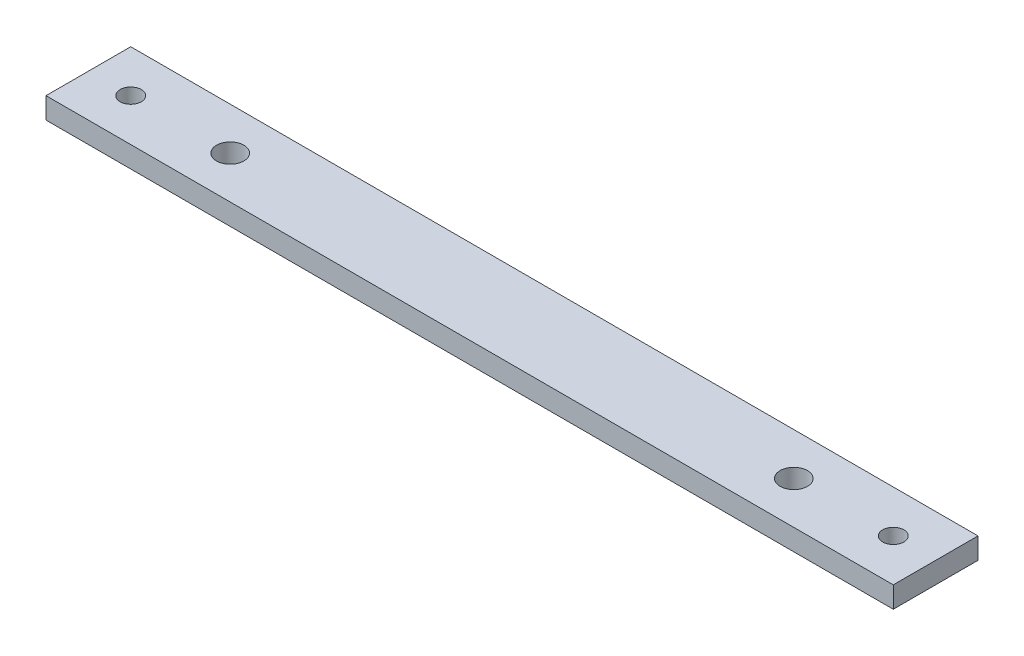
ISO-10303-21;
HEADER;
FILE_DESCRIPTION(('STEP AP214'),'2;1');
FILE_NAME('part.step','',(''),(''),'','','');
FILE_SCHEMA(('AUTOMOTIVE_DESIGN { 1 0 10303 214 1 1 1 1 }'));
ENDSEC;
DATA;
#1=APPLICATION_CONTEXT('core data for automotive mechanical design processes');
#2=APPLICATION_PROTOCOL_DEFINITION('international standard','automotive_design',2000,#1);
#3=PRODUCT_CONTEXT('',#1,'mechanical');
#4=PRODUCT('Part','Part','',(#3));
#5=PRODUCT_RELATED_PRODUCT_CATEGORY('part','',(#4));
#6=PRODUCT_DEFINITION_FORMATION('','',#4);
#7=PRODUCT_DEFINITION_CONTEXT('part definition',#1,'design');
#8=PRODUCT_DEFINITION('design','',#6,#7);
#9=PRODUCT_DEFINITION_SHAPE('','',#8);
#10=(LENGTH_UNIT() NAMED_UNIT(*) SI_UNIT(.MILLI.,.METRE.));
#11=(NAMED_UNIT(*) PLANE_ANGLE_UNIT() SI_UNIT($,.RADIAN.));
#12=(NAMED_UNIT(*) SI_UNIT($,.STERADIAN.) SOLID_ANGLE_UNIT());
#13=UNCERTAINTY_MEASURE_WITH_UNIT(LENGTH_MEASURE(1.E-05),#10,'distance_accuracy_value','');
#14=(GEOMETRIC_REPRESENTATION_CONTEXT(3) GLOBAL_UNCERTAINTY_ASSIGNED_CONTEXT((#13)) GLOBAL_UNIT_ASSIGNED_CONTEXT((#10,
#11,#12)) REPRESENTATION_CONTEXT('',''));
#15=CARTESIAN_POINT('',(0.,0.,0.));
#16=DIRECTION('',(0.,0.,1.));
#17=DIRECTION('',(1.,0.,0.));
#18=AXIS2_PLACEMENT_3D('',#15,#16,#17);
#19=CARTESIAN_POINT('',(0.,6.35,0.));
#20=DIRECTION('',(-1.,0.,0.));
#21=DIRECTION('',(0.,0.,1.));
#22=AXIS2_PLACEMENT_3D('',#19,#20,#21);
#23=PLANE('',#22);
#24=DIRECTION('',(0.,0.,-1.));
#25=VECTOR('',#24,1.);
#26=CARTESIAN_POINT('',(0.,0.,0.));
#27=LINE('',#26,#25);
#28=CARTESIAN_POINT('',(0.,0.,0.));
#29=VERTEX_POINT('',#28);
#30=CARTESIAN_POINT('',(0.,0.,-25.4));
#31=VERTEX_POINT('',#30);
#32=EDGE_CURVE('E99',#29,#31,#27,.T.);
#33=ORIENTED_EDGE('',*,*,#32,.T.);
#34=DIRECTION('',(0.,-1.,0.));
#35=VECTOR('',#34,1.);
#36=CARTESIAN_POINT('',(0.,6.35,-25.4));
#37=LINE('',#36,#35);
#38=CARTESIAN_POINT('',(0.,6.35,-25.4));
#39=VERTEX_POINT('',#38);
#40=EDGE_CURVE('E11',#39,#31,#37,.T.);
#41=ORIENTED_EDGE('',*,*,#40,.F.);
#42=DIRECTION('',(0.,0.,-1.));
#43=VECTOR('',#42,1.);
#44=CARTESIAN_POINT('',(0.,6.35,0.));
#45=LINE('',#44,#43);
#46=CARTESIAN_POINT('',(0.,6.35,0.));
#47=VERTEX_POINT('',#46);
#48=EDGE_CURVE('E87',#47,#39,#45,.T.);
#49=ORIENTED_EDGE('',*,*,#48,.F.);
#50=DIRECTION('',(0.,-1.,0.));
#51=VECTOR('',#50,1.);
#52=CARTESIAN_POINT('',(0.,6.35,0.));
#53=LINE('',#52,#51);
#54=EDGE_CURVE('E95',#47,#29,#53,.T.);
#55=ORIENTED_EDGE('',*,*,#54,.T.);
#56=EDGE_LOOP('',(#33,#41,#49,#55));
#57=FACE_BOUND('',#56,.T.);
#58=ADVANCED_FACE('F35',(#57),#23,.F.);
#59=CARTESIAN_POINT('',(0.,6.35,-25.4));
#60=DIRECTION('',(0.,0.,1.));
#61=DIRECTION('',(1.,0.,0.));
#62=AXIS2_PLACEMENT_3D('',#59,#60,#61);
#63=PLANE('',#62);
#64=DIRECTION('',(-1.,0.,0.));
#65=VECTOR('',#64,1.);
#66=CARTESIAN_POINT('',(0.,0.,-25.4));
#67=LINE('',#66,#65);
#68=CARTESIAN_POINT('',(-254.,0.,-25.4));
#69=VERTEX_POINT('',#68);
#70=EDGE_CURVE('E91',#31,#69,#67,.T.);
#71=ORIENTED_EDGE('',*,*,#70,.T.);
#72=DIRECTION('',(0.,-1.,0.));
#73=VECTOR('',#72,1.);
#74=CARTESIAN_POINT('',(-254.,6.35,-25.4));
#75=LINE('',#74,#73);
#76=CARTESIAN_POINT('',(-254.,6.35,-25.4));
#77=VERTEX_POINT('',#76);
#78=EDGE_CURVE('E44',#77,#69,#75,.T.);
#79=ORIENTED_EDGE('',*,*,#78,.F.);
#80=DIRECTION('',(-1.,0.,0.));
#81=VECTOR('',#80,1.);
#82=CARTESIAN_POINT('',(0.,6.35,-25.4));
#83=LINE('',#82,#81);
#84=EDGE_CURVE('E82',#39,#77,#83,.T.);
#85=ORIENTED_EDGE('',*,*,#84,.F.);
#86=ORIENTED_EDGE('',*,*,#40,.T.);
#87=EDGE_LOOP('',(#71,#79,#85,#86));
#88=FACE_BOUND('',#87,.T.);
#89=ADVANCED_FACE('F90',(#88),#63,.F.);
#90=CARTESIAN_POINT('',(-254.,6.35,0.));
#91=DIRECTION('',(1.,0.,0.));
#92=DIRECTION('',(0.,0.,-1.));
#93=AXIS2_PLACEMENT_3D('',#90,#91,#92);
#94=PLANE('',#93);
#95=DIRECTION('',(0.,0.,1.));
#96=VECTOR('',#95,1.);
#97=CARTESIAN_POINT('',(-254.,0.,0.));
#98=LINE('',#97,#96);
#99=CARTESIAN_POINT('',(-254.,0.,0.));
#100=VERTEX_POINT('',#99);
#101=EDGE_CURVE('E69',#69,#100,#98,.T.);
#102=ORIENTED_EDGE('',*,*,#101,.T.);
#103=DIRECTION('',(0.,-1.,0.));
#104=VECTOR('',#103,1.);
#105=CARTESIAN_POINT('',(-254.,6.35,0.));
#106=LINE('',#105,#104);
#107=CARTESIAN_POINT('',(-254.,6.35,0.));
#108=VERTEX_POINT('',#107);
#109=EDGE_CURVE('E92',#108,#100,#106,.T.);
#110=ORIENTED_EDGE('',*,*,#109,.F.);
#111=DIRECTION('',(0.,0.,1.));
#112=VECTOR('',#111,1.);
#113=CARTESIAN_POINT('',(-254.,6.35,0.));
#114=LINE('',#113,#112);
#115=EDGE_CURVE('E85',#77,#108,#114,.T.);
#116=ORIENTED_EDGE('',*,*,#115,.F.);
#117=ORIENTED_EDGE('',*,*,#78,.T.);
#118=EDGE_LOOP('',(#102,#110,#116,#117));
#119=FACE_BOUND('',#118,.T.);
#120=ADVANCED_FACE('F93',(#119),#94,.F.);
#121=CARTESIAN_POINT('',(0.,6.35,0.));
#122=DIRECTION('',(0.,0.,-1.));
#123=DIRECTION('',(-1.,0.,0.));
#124=AXIS2_PLACEMENT_3D('',#121,#122,#123);
#125=PLANE('',#124);
#126=DIRECTION('',(1.,0.,0.));
#127=VECTOR('',#126,1.);
#128=CARTESIAN_POINT('',(0.,0.,0.));
#129=LINE('',#128,#127);
#130=EDGE_CURVE('E75',#100,#29,#129,.T.);
#131=ORIENTED_EDGE('',*,*,#130,.T.);
#132=ORIENTED_EDGE('',*,*,#54,.F.);
#133=DIRECTION('',(1.,0.,0.));
#134=VECTOR('',#133,1.);
#135=CARTESIAN_POINT('',(0.,6.35,0.));
#136=LINE('',#135,#134);
#137=EDGE_CURVE('E52',#108,#47,#136,.T.);
#138=ORIENTED_EDGE('',*,*,#137,.F.);
#139=ORIENTED_EDGE('',*,*,#109,.T.);
#140=EDGE_LOOP('',(#131,#132,#138,#139));
#141=FACE_BOUND('',#140,.T.);
#142=ADVANCED_FACE('F114',(#141),#125,.F.);
#143=CARTESIAN_POINT('',(0.,6.35,0.));
#144=DIRECTION('',(0.,1.,0.));
#145=DIRECTION('',(0.,0.,1.));
#146=AXIS2_PLACEMENT_3D('',#143,#144,#145);
#147=PLANE('',#146);
#148=CARTESIAN_POINT('',(-241.3,6.35,-12.7));
#149=DIRECTION('',(0.,-1.,0.));
#150=DIRECTION('',(0.,0.,-1.));
#151=AXIS2_PLACEMENT_3D('',#148,#149,#150);
#152=CIRCLE('',#151,3.17500000000001);
#153=CARTESIAN_POINT('',(-241.3,6.35,-15.875));
#154=VERTEX_POINT('',#153);
#155=EDGE_CURVE('E141',#154,#154,#152,.T.);
#156=ORIENTED_EDGE('',*,*,#155,.T.);
#157=EDGE_LOOP('',(#156));
#158=FACE_BOUND('',#157,.T.);
#159=CARTESIAN_POINT('',(-12.7,6.35,-12.7));
#160=DIRECTION('',(0.,-1.,0.));
#161=DIRECTION('',(0.,0.,-1.));
#162=AXIS2_PLACEMENT_3D('',#159,#160,#161);
#163=CIRCLE('',#162,3.175);
#164=CARTESIAN_POINT('',(-12.7,6.35,-15.875));
#165=VERTEX_POINT('',#164);
#166=EDGE_CURVE('E132',#165,#165,#163,.T.);
#167=ORIENTED_EDGE('',*,*,#166,.T.);
#168=EDGE_LOOP('',(#167));
#169=FACE_BOUND('',#168,.T.);
#170=CARTESIAN_POINT('',(-42.5196,6.35,-12.7));
#171=DIRECTION('',(0.,-1.,0.));
#172=DIRECTION('',(0.,0.,-1.));
#173=AXIS2_PLACEMENT_3D('',#170,#171,#172);
#174=CIRCLE('',#173,4.1021);
#175=CARTESIAN_POINT('',(-42.5196,6.35,-16.8021));
#176=VERTEX_POINT('',#175);
#177=EDGE_CURVE('E124',#176,#176,#174,.T.);
#178=ORIENTED_EDGE('',*,*,#177,.T.);
#179=EDGE_LOOP('',(#178));
#180=FACE_BOUND('',#179,.T.);
#181=CARTESIAN_POINT('',(-211.4804,6.35,-12.7));
#182=DIRECTION('',(0.,-1.,0.));
#183=DIRECTION('',(0.,0.,-1.));
#184=AXIS2_PLACEMENT_3D('',#181,#182,#183);
#185=CIRCLE('',#184,4.10209999999999);
#186=CARTESIAN_POINT('',(-211.4804,6.35,-16.8021));
#187=VERTEX_POINT('',#186);
#188=EDGE_CURVE('E103',#187,#187,#185,.T.);
#189=ORIENTED_EDGE('',*,*,#188,.T.);
#190=EDGE_LOOP('',(#189));
#191=FACE_BOUND('',#190,.T.);
#192=ORIENTED_EDGE('',*,*,#48,.T.);
#193=ORIENTED_EDGE('',*,*,#84,.T.);
#194=ORIENTED_EDGE('',*,*,#115,.T.);
#195=ORIENTED_EDGE('',*,*,#137,.T.);
#196=EDGE_LOOP('',(#192,#193,#194,#195));
#197=FACE_BOUND('',#196,.T.);
#198=ADVANCED_FACE('F83',(#158,#169,#180,#191,#197),#147,.T.);
#199=CARTESIAN_POINT('',(0.,0.,0.));
#200=DIRECTION('',(0.,1.,0.));
#201=DIRECTION('',(0.,0.,1.));
#202=AXIS2_PLACEMENT_3D('',#199,#200,#201);
#203=PLANE('',#202);
#204=CARTESIAN_POINT('',(-241.3,0.,-12.7));
#205=DIRECTION('',(0.,-1.,0.));
#206=DIRECTION('',(0.,0.,-1.));
#207=AXIS2_PLACEMENT_3D('',#204,#205,#206);
#208=CIRCLE('',#207,3.17499999999998);
#209=CARTESIAN_POINT('',(-241.3,0.,-15.875));
#210=VERTEX_POINT('',#209);
#211=EDGE_CURVE('E144',#210,#210,#208,.T.);
#212=ORIENTED_EDGE('',*,*,#211,.F.);
#213=EDGE_LOOP('',(#212));
#214=FACE_BOUND('',#213,.T.);
#215=CARTESIAN_POINT('',(-12.7,0.,-12.7));
#216=DIRECTION('',(0.,-1.,0.));
#217=DIRECTION('',(0.,0.,-1.));
#218=AXIS2_PLACEMENT_3D('',#215,#216,#217);
#219=CIRCLE('',#218,3.17499999999999);
#220=CARTESIAN_POINT('',(-12.7,0.,-15.875));
#221=VERTEX_POINT('',#220);
#222=EDGE_CURVE('E138',#221,#221,#219,.T.);
#223=ORIENTED_EDGE('',*,*,#222,.F.);
#224=EDGE_LOOP('',(#223));
#225=FACE_BOUND('',#224,.T.);
#226=CARTESIAN_POINT('',(-42.5196,0.,-12.7));
#227=DIRECTION('',(0.,-1.,0.));
#228=DIRECTION('',(0.,0.,-1.));
#229=AXIS2_PLACEMENT_3D('',#226,#227,#228);
#230=CIRCLE('',#229,4.1021);
#231=CARTESIAN_POINT('',(-42.5196,0.,-16.8021));
#232=VERTEX_POINT('',#231);
#233=EDGE_CURVE('E128',#232,#232,#230,.T.);
#234=ORIENTED_EDGE('',*,*,#233,.F.);
#235=EDGE_LOOP('',(#234));
#236=FACE_BOUND('',#235,.T.);
#237=CARTESIAN_POINT('',(-211.4804,0.,-12.7));
#238=DIRECTION('',(0.,-1.,0.));
#239=DIRECTION('',(0.,0.,-1.));
#240=AXIS2_PLACEMENT_3D('',#237,#238,#239);
#241=CIRCLE('',#240,4.10209999999999);
#242=CARTESIAN_POINT('',(-211.4804,0.,-16.8021));
#243=VERTEX_POINT('',#242);
#244=EDGE_CURVE('E120',#243,#243,#241,.T.);
#245=ORIENTED_EDGE('',*,*,#244,.F.);
#246=EDGE_LOOP('',(#245));
#247=FACE_BOUND('',#246,.T.);
#248=ORIENTED_EDGE('',*,*,#32,.F.);
#249=ORIENTED_EDGE('',*,*,#130,.F.);
#250=ORIENTED_EDGE('',*,*,#101,.F.);
#251=ORIENTED_EDGE('',*,*,#70,.F.);
#252=EDGE_LOOP('',(#248,#249,#250,#251));
#253=FACE_BOUND('',#252,.T.);
#254=ADVANCED_FACE('F117',(#214,#225,#236,#247,#253),#203,.F.);
#255=CARTESIAN_POINT('',(-211.4804,6.35,-12.7));
#256=DIRECTION('',(0.,-1.,0.));
#257=DIRECTION('',(0.,0.,-1.));
#258=AXIS2_PLACEMENT_3D('',#255,#256,#257);
#259=CYLINDRICAL_SURFACE('',#258,4.10209999999999);
#260=ORIENTED_EDGE('',*,*,#188,.F.);
#261=EDGE_LOOP('',(#260));
#262=FACE_BOUND('',#261,.T.);
#263=ORIENTED_EDGE('',*,*,#244,.T.);
#264=EDGE_LOOP('',(#263));
#265=FACE_BOUND('',#264,.T.);
#266=ADVANCED_FACE('F152',(#262,#265),#259,.F.);
#267=CARTESIAN_POINT('',(-42.5196,6.35,-12.7));
#268=DIRECTION('',(0.,-1.,0.));
#269=DIRECTION('',(0.,0.,-1.));
#270=AXIS2_PLACEMENT_3D('',#267,#268,#269);
#271=CYLINDRICAL_SURFACE('',#270,4.1021);
#272=ORIENTED_EDGE('',*,*,#177,.F.);
#273=EDGE_LOOP('',(#272));
#274=FACE_BOUND('',#273,.T.);
#275=ORIENTED_EDGE('',*,*,#233,.T.);
#276=EDGE_LOOP('',(#275));
#277=FACE_BOUND('',#276,.T.);
#278=ADVANCED_FACE('F170',(#274,#277),#271,.F.);
#279=CARTESIAN_POINT('',(-12.7,0.,-12.7));
#280=DIRECTION('',(0.,-1.,0.));
#281=DIRECTION('',(0.,0.,-1.));
#282=AXIS2_PLACEMENT_3D('',#279,#280,#281);
#283=CYLINDRICAL_SURFACE('',#282,3.17499999999999);
#284=ORIENTED_EDGE('',*,*,#166,.F.);
#285=EDGE_LOOP('',(#284));
#286=FACE_BOUND('',#285,.T.);
#287=ORIENTED_EDGE('',*,*,#222,.T.);
#288=EDGE_LOOP('',(#287));
#289=FACE_BOUND('',#288,.T.);
#290=ADVANCED_FACE('F176',(#286,#289),#283,.F.);
#291=CARTESIAN_POINT('',(-241.3,0.,-12.7));
#292=DIRECTION('',(0.,-1.,0.));
#293=DIRECTION('',(0.,0.,-1.));
#294=AXIS2_PLACEMENT_3D('',#291,#292,#293);
#295=CYLINDRICAL_SURFACE('',#294,3.175);
#296=ORIENTED_EDGE('',*,*,#155,.F.);
#297=EDGE_LOOP('',(#296));
#298=FACE_BOUND('',#297,.T.);
#299=ORIENTED_EDGE('',*,*,#211,.T.);
#300=EDGE_LOOP('',(#299));
#301=FACE_BOUND('',#300,.T.);
#302=ADVANCED_FACE('F148',(#298,#301),#295,.F.);
#303=CLOSED_SHELL('',(#58,#89,#120,#142,#198,#254,#266,#278,#290,#302));
#304=MANIFOLD_SOLID_BREP('B2',#303);
#305=ADVANCED_BREP_SHAPE_REPRESENTATION('',(#18,#304),#14);
#306=SHAPE_DEFINITION_REPRESENTATION(#9,#305);
ENDSEC;
END-ISO-10303-21;
